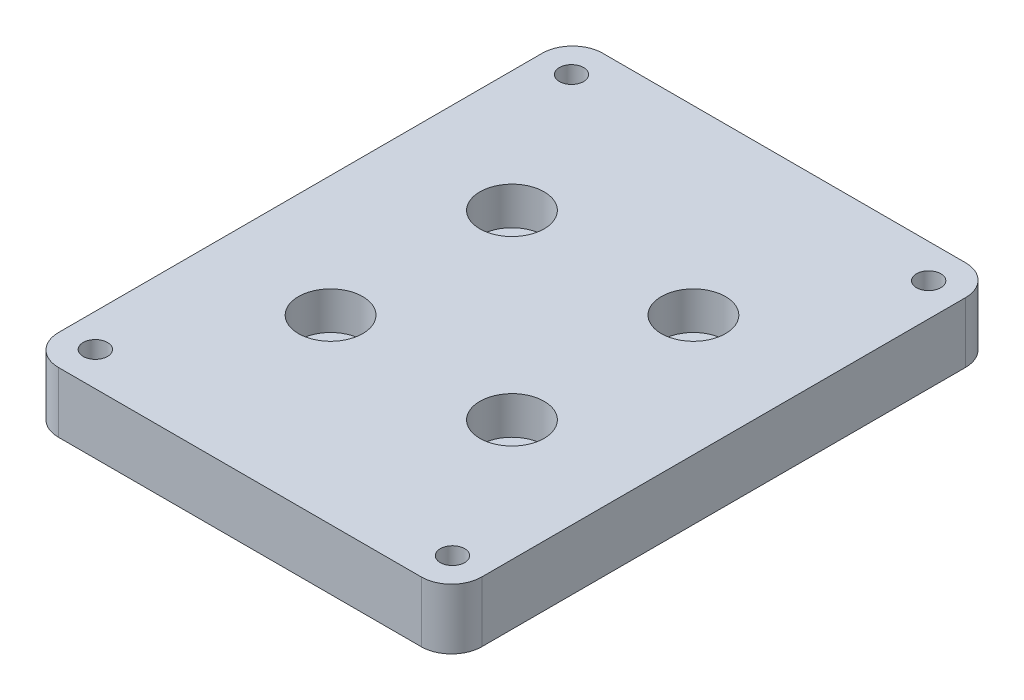
ISO-10303-21;
HEADER;
FILE_DESCRIPTION(('STEP AP214'),'2;1');
FILE_NAME('part.step','',(''),(''),'','','');
FILE_SCHEMA(('AUTOMOTIVE_DESIGN { 1 0 10303 214 1 1 1 1 }'));
ENDSEC;
DATA;
#1=APPLICATION_CONTEXT('core data for automotive mechanical design processes');
#2=APPLICATION_PROTOCOL_DEFINITION('international standard','automotive_design',2000,#1);
#3=PRODUCT_CONTEXT('',#1,'mechanical');
#4=PRODUCT('Part','Part','',(#3));
#5=PRODUCT_RELATED_PRODUCT_CATEGORY('part','',(#4));
#6=PRODUCT_DEFINITION_FORMATION('','',#4);
#7=PRODUCT_DEFINITION_CONTEXT('part definition',#1,'design');
#8=PRODUCT_DEFINITION('design','',#6,#7);
#9=PRODUCT_DEFINITION_SHAPE('','',#8);
#10=(LENGTH_UNIT() NAMED_UNIT(*) SI_UNIT(.MILLI.,.METRE.));
#11=(NAMED_UNIT(*) PLANE_ANGLE_UNIT() SI_UNIT($,.RADIAN.));
#12=(NAMED_UNIT(*) SI_UNIT($,.STERADIAN.) SOLID_ANGLE_UNIT());
#13=UNCERTAINTY_MEASURE_WITH_UNIT(LENGTH_MEASURE(1.E-05),#10,'distance_accuracy_value','');
#14=(GEOMETRIC_REPRESENTATION_CONTEXT(3) GLOBAL_UNCERTAINTY_ASSIGNED_CONTEXT((#13)) GLOBAL_UNIT_ASSIGNED_CONTEXT((#10,
#11,#12)) REPRESENTATION_CONTEXT('',''));
#15=CARTESIAN_POINT('',(0.,0.,0.));
#16=DIRECTION('',(0.,0.,1.));
#17=DIRECTION('',(1.,0.,0.));
#18=AXIS2_PLACEMENT_3D('',#15,#16,#17);
#19=CARTESIAN_POINT('',(-44.45,12.7,57.15));
#20=DIRECTION('',(1.,0.,0.));
#21=DIRECTION('',(0.,0.,-1.));
#22=AXIS2_PLACEMENT_3D('',#19,#20,#21);
#23=PLANE('',#22);
#24=DIRECTION('',(0.,0.,1.));
#25=VECTOR('',#24,1.);
#26=CARTESIAN_POINT('',(-44.45,12.7,57.15));
#27=LINE('',#26,#25);
#28=CARTESIAN_POINT('',(-44.45,12.7,-50.8));
#29=VERTEX_POINT('',#28);
#30=CARTESIAN_POINT('',(-44.45,12.7,50.8));
#31=VERTEX_POINT('',#30);
#32=EDGE_CURVE('E121',#29,#31,#27,.T.);
#33=ORIENTED_EDGE('',*,*,#32,.F.);
#34=DIRECTION('',(0.,-1.,0.));
#35=VECTOR('',#34,1.);
#36=CARTESIAN_POINT('',(-44.45,12.7,-50.8));
#37=LINE('',#36,#35);
#38=CARTESIAN_POINT('',(-44.45,0.,-50.8));
#39=VERTEX_POINT('',#38);
#40=EDGE_CURVE('E106',#29,#39,#37,.T.);
#41=ORIENTED_EDGE('',*,*,#40,.T.);
#42=DIRECTION('',(0.,0.,1.));
#43=VECTOR('',#42,1.);
#44=CARTESIAN_POINT('',(-44.45,0.,57.15));
#45=LINE('',#44,#43);
#46=CARTESIAN_POINT('',(-44.45,0.,50.8));
#47=VERTEX_POINT('',#46);
#48=EDGE_CURVE('E118',#39,#47,#45,.T.);
#49=ORIENTED_EDGE('',*,*,#48,.T.);
#50=DIRECTION('',(0.,-1.,0.));
#51=VECTOR('',#50,1.);
#52=CARTESIAN_POINT('',(-44.45,12.7,50.8));
#53=LINE('',#52,#51);
#54=EDGE_CURVE('E123',#47,#31,#53,.F.);
#55=ORIENTED_EDGE('',*,*,#54,.T.);
#56=EDGE_LOOP('',(#33,#41,#49,#55));
#57=FACE_BOUND('',#56,.T.);
#58=ADVANCED_FACE('F36',(#57),#23,.F.);
#59=CARTESIAN_POINT('',(44.45,12.7,57.15));
#60=DIRECTION('',(0.,0.,-1.));
#61=DIRECTION('',(-1.,0.,0.));
#62=AXIS2_PLACEMENT_3D('',#59,#60,#61);
#63=PLANE('',#62);
#64=DIRECTION('',(1.,0.,0.));
#65=VECTOR('',#64,1.);
#66=CARTESIAN_POINT('',(44.45,0.,57.15));
#67=LINE('',#66,#65);
#68=CARTESIAN_POINT('',(-38.1,0.,57.15));
#69=VERTEX_POINT('',#68);
#70=CARTESIAN_POINT('',(38.1,0.,57.15));
#71=VERTEX_POINT('',#70);
#72=EDGE_CURVE('E127',#69,#71,#67,.T.);
#73=ORIENTED_EDGE('',*,*,#72,.T.);
#74=DIRECTION('',(0.,-1.,0.));
#75=VECTOR('',#74,1.);
#76=CARTESIAN_POINT('',(38.1,12.7,57.15));
#77=LINE('',#76,#75);
#78=CARTESIAN_POINT('',(38.1,12.7,57.15));
#79=VERTEX_POINT('',#78);
#80=EDGE_CURVE('E11',#71,#79,#77,.F.);
#81=ORIENTED_EDGE('',*,*,#80,.T.);
#82=DIRECTION('',(1.,0.,0.));
#83=VECTOR('',#82,1.);
#84=CARTESIAN_POINT('',(44.45,12.7,57.15));
#85=LINE('',#84,#83);
#86=CARTESIAN_POINT('',(-38.1,12.7,57.15));
#87=VERTEX_POINT('',#86);
#88=EDGE_CURVE('E167',#87,#79,#85,.T.);
#89=ORIENTED_EDGE('',*,*,#88,.F.);
#90=DIRECTION('',(0.,-1.,0.));
#91=VECTOR('',#90,1.);
#92=CARTESIAN_POINT('',(-38.1,12.7,57.15));
#93=LINE('',#92,#91);
#94=EDGE_CURVE('E44',#87,#69,#93,.T.);
#95=ORIENTED_EDGE('',*,*,#94,.T.);
#96=EDGE_LOOP('',(#73,#81,#89,#95));
#97=FACE_BOUND('',#96,.T.);
#98=ADVANCED_FACE('F165',(#97),#63,.F.);
#99=CARTESIAN_POINT('',(44.45,12.7,57.15));
#100=DIRECTION('',(-1.,0.,0.));
#101=DIRECTION('',(0.,0.,1.));
#102=AXIS2_PLACEMENT_3D('',#99,#100,#101);
#103=PLANE('',#102);
#104=DIRECTION('',(0.,0.,-1.));
#105=VECTOR('',#104,1.);
#106=CARTESIAN_POINT('',(44.45,0.,57.15));
#107=LINE('',#106,#105);
#108=CARTESIAN_POINT('',(44.45,0.,50.8));
#109=VERTEX_POINT('',#108);
#110=CARTESIAN_POINT('',(44.45,0.,-50.8));
#111=VERTEX_POINT('',#110);
#112=EDGE_CURVE('E131',#109,#111,#107,.T.);
#113=ORIENTED_EDGE('',*,*,#112,.T.);
#114=DIRECTION('',(0.,-1.,0.));
#115=VECTOR('',#114,1.);
#116=CARTESIAN_POINT('',(44.45,12.7,-50.8));
#117=LINE('',#116,#115);
#118=CARTESIAN_POINT('',(44.45,12.7,-50.8));
#119=VERTEX_POINT('',#118);
#120=EDGE_CURVE('E51',#111,#119,#117,.F.);
#121=ORIENTED_EDGE('',*,*,#120,.T.);
#122=DIRECTION('',(0.,0.,-1.));
#123=VECTOR('',#122,1.);
#124=CARTESIAN_POINT('',(44.45,12.7,57.15));
#125=LINE('',#124,#123);
#126=CARTESIAN_POINT('',(44.45,12.7,50.8));
#127=VERTEX_POINT('',#126);
#128=EDGE_CURVE('E175',#127,#119,#125,.T.);
#129=ORIENTED_EDGE('',*,*,#128,.F.);
#130=DIRECTION('',(0.,-1.,0.));
#131=VECTOR('',#130,1.);
#132=CARTESIAN_POINT('',(44.45,12.7,50.8));
#133=LINE('',#132,#131);
#134=EDGE_CURVE('E158',#127,#109,#133,.T.);
#135=ORIENTED_EDGE('',*,*,#134,.T.);
#136=EDGE_LOOP('',(#113,#121,#129,#135));
#137=FACE_BOUND('',#136,.T.);
#138=ADVANCED_FACE('F174',(#137),#103,.F.);
#139=CARTESIAN_POINT('',(44.45,12.7,-57.15));
#140=DIRECTION('',(0.,0.,1.));
#141=DIRECTION('',(1.,0.,0.));
#142=AXIS2_PLACEMENT_3D('',#139,#140,#141);
#143=PLANE('',#142);
#144=DIRECTION('',(-1.,0.,0.));
#145=VECTOR('',#144,1.);
#146=CARTESIAN_POINT('',(44.45,0.,-57.15));
#147=LINE('',#146,#145);
#148=CARTESIAN_POINT('',(38.1,0.,-57.15));
#149=VERTEX_POINT('',#148);
#150=CARTESIAN_POINT('',(-38.1,0.,-57.15));
#151=VERTEX_POINT('',#150);
#152=EDGE_CURVE('E141',#149,#151,#147,.T.);
#153=ORIENTED_EDGE('',*,*,#152,.T.);
#154=DIRECTION('',(0.,-1.,0.));
#155=VECTOR('',#154,1.);
#156=CARTESIAN_POINT('',(-38.1,12.7,-57.15));
#157=LINE('',#156,#155);
#158=CARTESIAN_POINT('',(-38.1,12.7,-57.15));
#159=VERTEX_POINT('',#158);
#160=EDGE_CURVE('E107',#151,#159,#157,.F.);
#161=ORIENTED_EDGE('',*,*,#160,.T.);
#162=DIRECTION('',(-1.,0.,0.));
#163=VECTOR('',#162,1.);
#164=CARTESIAN_POINT('',(44.45,12.7,-57.15));
#165=LINE('',#164,#163);
#166=CARTESIAN_POINT('',(38.1,12.7,-57.15));
#167=VERTEX_POINT('',#166);
#168=EDGE_CURVE('E137',#167,#159,#165,.T.);
#169=ORIENTED_EDGE('',*,*,#168,.F.);
#170=DIRECTION('',(0.,-1.,0.));
#171=VECTOR('',#170,1.);
#172=CARTESIAN_POINT('',(38.1,12.7,-57.15));
#173=LINE('',#172,#171);
#174=EDGE_CURVE('E112',#167,#149,#173,.T.);
#175=ORIENTED_EDGE('',*,*,#174,.T.);
#176=EDGE_LOOP('',(#153,#161,#169,#175));
#177=FACE_BOUND('',#176,.T.);
#178=ADVANCED_FACE('F255',(#177),#143,.F.);
#179=CARTESIAN_POINT('',(0.,12.7,0.));
#180=DIRECTION('',(0.,1.,0.));
#181=DIRECTION('',(0.,0.,1.));
#182=AXIS2_PLACEMENT_3D('',#179,#180,#181);
#183=PLANE('',#182);
#184=CARTESIAN_POINT('',(-37.5,12.7,-50.));
#185=DIRECTION('',(0.,1.,0.));
#186=DIRECTION('',(0.,0.,1.));
#187=AXIS2_PLACEMENT_3D('',#184,#185,#186);
#188=CIRCLE('',#187,2.5527);
#189=CARTESIAN_POINT('',(-37.5,12.7,-47.4473));
#190=VERTEX_POINT('',#189);
#191=EDGE_CURVE('E246',#190,#190,#188,.T.);
#192=ORIENTED_EDGE('',*,*,#191,.F.);
#193=EDGE_LOOP('',(#192));
#194=FACE_BOUND('',#193,.T.);
#195=CARTESIAN_POINT('',(37.5,12.7,-50.));
#196=DIRECTION('',(0.,1.,0.));
#197=DIRECTION('',(0.,0.,1.));
#198=AXIS2_PLACEMENT_3D('',#195,#196,#197);
#199=CIRCLE('',#198,2.5527);
#200=CARTESIAN_POINT('',(37.5,12.7,-47.4473));
#201=VERTEX_POINT('',#200);
#202=EDGE_CURVE('E240',#201,#201,#199,.T.);
#203=ORIENTED_EDGE('',*,*,#202,.F.);
#204=EDGE_LOOP('',(#203));
#205=FACE_BOUND('',#204,.T.);
#206=CARTESIAN_POINT('',(37.5,12.7,50.));
#207=DIRECTION('',(0.,1.,0.));
#208=DIRECTION('',(0.,0.,1.));
#209=AXIS2_PLACEMENT_3D('',#206,#207,#208);
#210=CIRCLE('',#209,2.5527);
#211=CARTESIAN_POINT('',(37.5,12.7,52.5527));
#212=VERTEX_POINT('',#211);
#213=EDGE_CURVE('E234',#212,#212,#210,.T.);
#214=ORIENTED_EDGE('',*,*,#213,.F.);
#215=EDGE_LOOP('',(#214));
#216=FACE_BOUND('',#215,.T.);
#217=CARTESIAN_POINT('',(-37.5,12.7,50.));
#218=DIRECTION('',(0.,1.,0.));
#219=DIRECTION('',(0.,0.,1.));
#220=AXIS2_PLACEMENT_3D('',#217,#218,#219);
#221=CIRCLE('',#220,2.5527);
#222=CARTESIAN_POINT('',(-37.5,12.7,52.5527));
#223=VERTEX_POINT('',#222);
#224=EDGE_CURVE('E228',#223,#223,#221,.T.);
#225=ORIENTED_EDGE('',*,*,#224,.F.);
#226=EDGE_LOOP('',(#225));
#227=FACE_BOUND('',#226,.T.);
#228=CARTESIAN_POINT('',(-19.05,12.7,-19.05));
#229=DIRECTION('',(0.,1.,0.));
#230=DIRECTION('',(0.,0.,1.));
#231=AXIS2_PLACEMENT_3D('',#228,#229,#230);
#232=CIRCLE('',#231,6.74751);
#233=CARTESIAN_POINT('',(-19.05,12.7,-12.30249));
#234=VERTEX_POINT('',#233);
#235=EDGE_CURVE('E222',#234,#234,#232,.T.);
#236=ORIENTED_EDGE('',*,*,#235,.F.);
#237=EDGE_LOOP('',(#236));
#238=FACE_BOUND('',#237,.T.);
#239=CARTESIAN_POINT('',(-19.05,12.7,19.05));
#240=DIRECTION('',(0.,1.,0.));
#241=DIRECTION('',(0.,0.,1.));
#242=AXIS2_PLACEMENT_3D('',#239,#240,#241);
#243=CIRCLE('',#242,6.74751);
#244=CARTESIAN_POINT('',(-19.05,12.7,25.79751));
#245=VERTEX_POINT('',#244);
#246=EDGE_CURVE('E210',#245,#245,#243,.T.);
#247=ORIENTED_EDGE('',*,*,#246,.F.);
#248=EDGE_LOOP('',(#247));
#249=FACE_BOUND('',#248,.T.);
#250=CARTESIAN_POINT('',(19.05,12.7,19.05));
#251=DIRECTION('',(0.,1.,0.));
#252=DIRECTION('',(0.,0.,1.));
#253=AXIS2_PLACEMENT_3D('',#250,#251,#252);
#254=CIRCLE('',#253,6.74751);
#255=CARTESIAN_POINT('',(19.05,12.7,25.79751));
#256=VERTEX_POINT('',#255);
#257=EDGE_CURVE('E198',#256,#256,#254,.T.);
#258=ORIENTED_EDGE('',*,*,#257,.F.);
#259=EDGE_LOOP('',(#258));
#260=FACE_BOUND('',#259,.T.);
#261=CARTESIAN_POINT('',(19.05,12.7,-19.05));
#262=DIRECTION('',(0.,1.,0.));
#263=DIRECTION('',(0.,0.,1.));
#264=AXIS2_PLACEMENT_3D('',#261,#262,#263);
#265=CIRCLE('',#264,6.74751);
#266=CARTESIAN_POINT('',(19.05,12.7,-12.30249));
#267=VERTEX_POINT('',#266);
#268=EDGE_CURVE('E186',#267,#267,#265,.T.);
#269=ORIENTED_EDGE('',*,*,#268,.F.);
#270=EDGE_LOOP('',(#269));
#271=FACE_BOUND('',#270,.T.);
#272=ORIENTED_EDGE('',*,*,#168,.T.);
#273=CARTESIAN_POINT('',(-38.1,12.7,-50.8));
#274=DIRECTION('',(0.,1.,0.));
#275=DIRECTION('',(0.,0.,1.));
#276=AXIS2_PLACEMENT_3D('',#273,#274,#275);
#277=CIRCLE('',#276,6.35);
#278=EDGE_CURVE('E156',#159,#29,#277,.T.);
#279=ORIENTED_EDGE('',*,*,#278,.T.);
#280=ORIENTED_EDGE('',*,*,#32,.T.);
#281=CARTESIAN_POINT('',(-38.1,12.7,50.8));
#282=DIRECTION('',(0.,1.,0.));
#283=DIRECTION('',(0.,0.,1.));
#284=AXIS2_PLACEMENT_3D('',#281,#282,#283);
#285=CIRCLE('',#284,6.35);
#286=EDGE_CURVE('E151',#31,#87,#285,.T.);
#287=ORIENTED_EDGE('',*,*,#286,.T.);
#288=ORIENTED_EDGE('',*,*,#88,.T.);
#289=CARTESIAN_POINT('',(38.1,12.7,50.8));
#290=DIRECTION('',(0.,1.,0.));
#291=DIRECTION('',(0.,0.,1.));
#292=AXIS2_PLACEMENT_3D('',#289,#290,#291);
#293=CIRCLE('',#292,6.35);
#294=EDGE_CURVE('E58',#79,#127,#293,.T.);
#295=ORIENTED_EDGE('',*,*,#294,.T.);
#296=ORIENTED_EDGE('',*,*,#128,.T.);
#297=CARTESIAN_POINT('',(38.1,12.7,-50.8));
#298=DIRECTION('',(0.,1.,0.));
#299=DIRECTION('',(0.,0.,1.));
#300=AXIS2_PLACEMENT_3D('',#297,#298,#299);
#301=CIRCLE('',#300,6.35);
#302=EDGE_CURVE('E154',#119,#167,#301,.T.);
#303=ORIENTED_EDGE('',*,*,#302,.T.);
#304=EDGE_LOOP('',(#272,#279,#280,#287,#288,#295,#296,#303));
#305=FACE_BOUND('',#304,.T.);
#306=ADVANCED_FACE('F252',(#194,#205,#216,#227,#238,#249,#260,#271,#305),#183,.T.);
#307=CARTESIAN_POINT('',(0.,0.,0.));
#308=DIRECTION('',(0.,1.,0.));
#309=DIRECTION('',(0.,0.,1.));
#310=AXIS2_PLACEMENT_3D('',#307,#308,#309);
#311=PLANE('',#310);
#312=CARTESIAN_POINT('',(-37.5,0.,-50.));
#313=DIRECTION('',(0.,1.,0.));
#314=DIRECTION('',(0.,0.,1.));
#315=AXIS2_PLACEMENT_3D('',#312,#313,#314);
#316=CIRCLE('',#315,2.5527);
#317=CARTESIAN_POINT('',(-37.5,0.,-47.4473));
#318=VERTEX_POINT('',#317);
#319=EDGE_CURVE('E243',#318,#318,#316,.T.);
#320=ORIENTED_EDGE('',*,*,#319,.T.);
#321=EDGE_LOOP('',(#320));
#322=FACE_BOUND('',#321,.T.);
#323=CARTESIAN_POINT('',(37.5,0.,-50.));
#324=DIRECTION('',(0.,1.,0.));
#325=DIRECTION('',(0.,0.,1.));
#326=AXIS2_PLACEMENT_3D('',#323,#324,#325);
#327=CIRCLE('',#326,2.5527);
#328=CARTESIAN_POINT('',(37.5,0.,-47.4473));
#329=VERTEX_POINT('',#328);
#330=EDGE_CURVE('E237',#329,#329,#327,.T.);
#331=ORIENTED_EDGE('',*,*,#330,.T.);
#332=EDGE_LOOP('',(#331));
#333=FACE_BOUND('',#332,.T.);
#334=CARTESIAN_POINT('',(37.5,0.,50.));
#335=DIRECTION('',(0.,1.,0.));
#336=DIRECTION('',(0.,0.,1.));
#337=AXIS2_PLACEMENT_3D('',#334,#335,#336);
#338=CIRCLE('',#337,2.5527);
#339=CARTESIAN_POINT('',(37.5,0.,52.5527));
#340=VERTEX_POINT('',#339);
#341=EDGE_CURVE('E231',#340,#340,#338,.T.);
#342=ORIENTED_EDGE('',*,*,#341,.T.);
#343=EDGE_LOOP('',(#342));
#344=FACE_BOUND('',#343,.T.);
#345=CARTESIAN_POINT('',(-37.5,0.,50.));
#346=DIRECTION('',(0.,1.,0.));
#347=DIRECTION('',(0.,0.,1.));
#348=AXIS2_PLACEMENT_3D('',#345,#346,#347);
#349=CIRCLE('',#348,2.5527);
#350=CARTESIAN_POINT('',(-37.5,0.,52.5527));
#351=VERTEX_POINT('',#350);
#352=EDGE_CURVE('E225',#351,#351,#349,.T.);
#353=ORIENTED_EDGE('',*,*,#352,.T.);
#354=EDGE_LOOP('',(#353));
#355=FACE_BOUND('',#354,.T.);
#356=CARTESIAN_POINT('',(-19.05,0.,-19.05));
#357=DIRECTION('',(0.,1.,0.));
#358=DIRECTION('',(0.,0.,1.));
#359=AXIS2_PLACEMENT_3D('',#356,#357,#358);
#360=CIRCLE('',#359,4.2164);
#361=CARTESIAN_POINT('',(-19.05,0.,-14.8336));
#362=VERTEX_POINT('',#361);
#363=EDGE_CURVE('E213',#362,#362,#360,.T.);
#364=ORIENTED_EDGE('',*,*,#363,.T.);
#365=EDGE_LOOP('',(#364));
#366=FACE_BOUND('',#365,.T.);
#367=CARTESIAN_POINT('',(-19.05,0.,19.05));
#368=DIRECTION('',(0.,1.,0.));
#369=DIRECTION('',(0.,0.,1.));
#370=AXIS2_PLACEMENT_3D('',#367,#368,#369);
#371=CIRCLE('',#370,4.2164);
#372=CARTESIAN_POINT('',(-19.05,0.,23.2664));
#373=VERTEX_POINT('',#372);
#374=EDGE_CURVE('E201',#373,#373,#371,.T.);
#375=ORIENTED_EDGE('',*,*,#374,.T.);
#376=EDGE_LOOP('',(#375));
#377=FACE_BOUND('',#376,.T.);
#378=CARTESIAN_POINT('',(19.05,0.,19.05));
#379=DIRECTION('',(0.,1.,0.));
#380=DIRECTION('',(0.,0.,1.));
#381=AXIS2_PLACEMENT_3D('',#378,#379,#380);
#382=CIRCLE('',#381,4.2164);
#383=CARTESIAN_POINT('',(19.05,0.,23.2664));
#384=VERTEX_POINT('',#383);
#385=EDGE_CURVE('E189',#384,#384,#382,.T.);
#386=ORIENTED_EDGE('',*,*,#385,.T.);
#387=EDGE_LOOP('',(#386));
#388=FACE_BOUND('',#387,.T.);
#389=CARTESIAN_POINT('',(19.05,0.,-19.05));
#390=DIRECTION('',(0.,1.,0.));
#391=DIRECTION('',(0.,0.,1.));
#392=AXIS2_PLACEMENT_3D('',#389,#390,#391);
#393=CIRCLE('',#392,4.2164);
#394=CARTESIAN_POINT('',(19.05,0.,-14.8336));
#395=VERTEX_POINT('',#394);
#396=EDGE_CURVE('E128',#395,#395,#393,.T.);
#397=ORIENTED_EDGE('',*,*,#396,.T.);
#398=EDGE_LOOP('',(#397));
#399=FACE_BOUND('',#398,.T.);
#400=ORIENTED_EDGE('',*,*,#48,.F.);
#401=CARTESIAN_POINT('',(-38.1,0.,-50.8));
#402=DIRECTION('',(0.,1.,0.));
#403=DIRECTION('',(0.,0.,1.));
#404=AXIS2_PLACEMENT_3D('',#401,#402,#403);
#405=CIRCLE('',#404,6.35);
#406=EDGE_CURVE('E102',#39,#151,#405,.F.);
#407=ORIENTED_EDGE('',*,*,#406,.T.);
#408=ORIENTED_EDGE('',*,*,#152,.F.);
#409=CARTESIAN_POINT('',(38.1,0.,-50.8));
#410=DIRECTION('',(0.,1.,0.));
#411=DIRECTION('',(0.,0.,1.));
#412=AXIS2_PLACEMENT_3D('',#409,#410,#411);
#413=CIRCLE('',#412,6.35);
#414=EDGE_CURVE('E113',#149,#111,#413,.F.);
#415=ORIENTED_EDGE('',*,*,#414,.T.);
#416=ORIENTED_EDGE('',*,*,#112,.F.);
#417=CARTESIAN_POINT('',(38.1,0.,50.8));
#418=DIRECTION('',(0.,1.,0.));
#419=DIRECTION('',(0.,0.,1.));
#420=AXIS2_PLACEMENT_3D('',#417,#418,#419);
#421=CIRCLE('',#420,6.35);
#422=EDGE_CURVE('E145',#109,#71,#421,.F.);
#423=ORIENTED_EDGE('',*,*,#422,.T.);
#424=ORIENTED_EDGE('',*,*,#72,.F.);
#425=CARTESIAN_POINT('',(-38.1,0.,50.8));
#426=DIRECTION('',(0.,1.,0.));
#427=DIRECTION('',(0.,0.,1.));
#428=AXIS2_PLACEMENT_3D('',#425,#426,#427);
#429=CIRCLE('',#428,6.35);
#430=EDGE_CURVE('E122',#69,#47,#429,.F.);
#431=ORIENTED_EDGE('',*,*,#430,.T.);
#432=EDGE_LOOP('',(#400,#407,#408,#415,#416,#423,#424,#431));
#433=FACE_BOUND('',#432,.T.);
#434=ADVANCED_FACE('F125',(#322,#333,#344,#355,#366,#377,#388,#399,#433),#311,.F.);
#435=CARTESIAN_POINT('',(-38.1,12.7,-50.8));
#436=DIRECTION('',(0.,-1.,0.));
#437=DIRECTION('',(0.,0.,-1.));
#438=AXIS2_PLACEMENT_3D('',#435,#436,#437);
#439=CYLINDRICAL_SURFACE('',#438,6.35);
#440=ORIENTED_EDGE('',*,*,#278,.F.);
#441=ORIENTED_EDGE('',*,*,#160,.F.);
#442=ORIENTED_EDGE('',*,*,#406,.F.);
#443=ORIENTED_EDGE('',*,*,#40,.F.);
#444=EDGE_LOOP('',(#440,#441,#442,#443));
#445=FACE_BOUND('',#444,.T.);
#446=ADVANCED_FACE('F105',(#445),#439,.T.);
#447=CARTESIAN_POINT('',(38.1,12.7,-50.8));
#448=DIRECTION('',(0.,-1.,0.));
#449=DIRECTION('',(0.,0.,-1.));
#450=AXIS2_PLACEMENT_3D('',#447,#448,#449);
#451=CYLINDRICAL_SURFACE('',#450,6.35);
#452=ORIENTED_EDGE('',*,*,#302,.F.);
#453=ORIENTED_EDGE('',*,*,#120,.F.);
#454=ORIENTED_EDGE('',*,*,#414,.F.);
#455=ORIENTED_EDGE('',*,*,#174,.F.);
#456=EDGE_LOOP('',(#452,#453,#454,#455));
#457=FACE_BOUND('',#456,.T.);
#458=ADVANCED_FACE('F274',(#457),#451,.T.);
#459=CARTESIAN_POINT('',(38.1,12.7,50.8));
#460=DIRECTION('',(0.,-1.,0.));
#461=DIRECTION('',(0.,0.,-1.));
#462=AXIS2_PLACEMENT_3D('',#459,#460,#461);
#463=CYLINDRICAL_SURFACE('',#462,6.35);
#464=ORIENTED_EDGE('',*,*,#294,.F.);
#465=ORIENTED_EDGE('',*,*,#80,.F.);
#466=ORIENTED_EDGE('',*,*,#422,.F.);
#467=ORIENTED_EDGE('',*,*,#134,.F.);
#468=EDGE_LOOP('',(#464,#465,#466,#467));
#469=FACE_BOUND('',#468,.T.);
#470=ADVANCED_FACE('F173',(#469),#463,.T.);
#471=CARTESIAN_POINT('',(-38.1,12.7,50.8));
#472=DIRECTION('',(0.,-1.,0.));
#473=DIRECTION('',(0.,0.,-1.));
#474=AXIS2_PLACEMENT_3D('',#471,#472,#473);
#475=CYLINDRICAL_SURFACE('',#474,6.35);
#476=ORIENTED_EDGE('',*,*,#286,.F.);
#477=ORIENTED_EDGE('',*,*,#54,.F.);
#478=ORIENTED_EDGE('',*,*,#430,.F.);
#479=ORIENTED_EDGE('',*,*,#94,.F.);
#480=EDGE_LOOP('',(#476,#477,#478,#479));
#481=FACE_BOUND('',#480,.T.);
#482=ADVANCED_FACE('F38',(#481),#475,.T.);
#483=CARTESIAN_POINT('',(19.05,12.7,-19.05));
#484=DIRECTION('',(0.,1.,0.));
#485=DIRECTION('',(0.,0.,1.));
#486=AXIS2_PLACEMENT_3D('',#483,#484,#485);
#487=CYLINDRICAL_SURFACE('',#486,4.2164);
#488=ORIENTED_EDGE('',*,*,#396,.F.);
#489=EDGE_LOOP('',(#488));
#490=FACE_BOUND('',#489,.T.);
#491=CARTESIAN_POINT('',(19.05,4.7625,-19.05));
#492=DIRECTION('',(0.,1.,0.));
#493=DIRECTION('',(0.,0.,1.));
#494=AXIS2_PLACEMENT_3D('',#491,#492,#493);
#495=CIRCLE('',#494,4.2164);
#496=CARTESIAN_POINT('',(19.05,4.7625,-14.8336));
#497=VERTEX_POINT('',#496);
#498=EDGE_CURVE('E134',#497,#497,#495,.T.);
#499=ORIENTED_EDGE('',*,*,#498,.T.);
#500=EDGE_LOOP('',(#499));
#501=FACE_BOUND('',#500,.T.);
#502=ADVANCED_FACE('F296',(#490,#501),#487,.F.);
#503=CARTESIAN_POINT('',(23.2664,4.7625,-19.05));
#504=DIRECTION('',(0.,-1.,0.));
#505=DIRECTION('',(0.,0.,-1.));
#506=AXIS2_PLACEMENT_3D('',#503,#504,#505);
#507=PLANE('',#506);
#508=ORIENTED_EDGE('',*,*,#498,.F.);
#509=EDGE_LOOP('',(#508));
#510=FACE_BOUND('',#509,.T.);
#511=CARTESIAN_POINT('',(19.05,4.7625,-19.05));
#512=DIRECTION('',(0.,1.,0.));
#513=DIRECTION('',(0.,0.,1.));
#514=AXIS2_PLACEMENT_3D('',#511,#512,#513);
#515=CIRCLE('',#514,6.74751);
#516=CARTESIAN_POINT('',(19.05,4.7625,-12.30249));
#517=VERTEX_POINT('',#516);
#518=EDGE_CURVE('E183',#517,#517,#515,.T.);
#519=ORIENTED_EDGE('',*,*,#518,.T.);
#520=EDGE_LOOP('',(#519));
#521=FACE_BOUND('',#520,.T.);
#522=ADVANCED_FACE('F299',(#510,#521),#507,.F.);
#523=CARTESIAN_POINT('',(19.05,12.7,-19.05));
#524=DIRECTION('',(0.,1.,0.));
#525=DIRECTION('',(0.,0.,1.));
#526=AXIS2_PLACEMENT_3D('',#523,#524,#525);
#527=CYLINDRICAL_SURFACE('',#526,6.74751);
#528=ORIENTED_EDGE('',*,*,#518,.F.);
#529=EDGE_LOOP('',(#528));
#530=FACE_BOUND('',#529,.T.);
#531=ORIENTED_EDGE('',*,*,#268,.T.);
#532=EDGE_LOOP('',(#531));
#533=FACE_BOUND('',#532,.T.);
#534=ADVANCED_FACE('F303',(#530,#533),#527,.F.);
#535=CARTESIAN_POINT('',(19.05,12.7,19.05));
#536=DIRECTION('',(0.,1.,0.));
#537=DIRECTION('',(0.,0.,1.));
#538=AXIS2_PLACEMENT_3D('',#535,#536,#537);
#539=CYLINDRICAL_SURFACE('',#538,4.2164);
#540=ORIENTED_EDGE('',*,*,#385,.F.);
#541=EDGE_LOOP('',(#540));
#542=FACE_BOUND('',#541,.T.);
#543=CARTESIAN_POINT('',(19.05,4.7625,19.05));
#544=DIRECTION('',(0.,1.,0.));
#545=DIRECTION('',(0.,0.,1.));
#546=AXIS2_PLACEMENT_3D('',#543,#544,#545);
#547=CIRCLE('',#546,4.2164);
#548=CARTESIAN_POINT('',(19.05,4.7625,23.2664));
#549=VERTEX_POINT('',#548);
#550=EDGE_CURVE('E192',#549,#549,#547,.T.);
#551=ORIENTED_EDGE('',*,*,#550,.T.);
#552=EDGE_LOOP('',(#551));
#553=FACE_BOUND('',#552,.T.);
#554=ADVANCED_FACE('F307',(#542,#553),#539,.F.);
#555=CARTESIAN_POINT('',(23.2664,4.7625,19.05));
#556=DIRECTION('',(0.,-1.,0.));
#557=DIRECTION('',(0.,0.,-1.));
#558=AXIS2_PLACEMENT_3D('',#555,#556,#557);
#559=PLANE('',#558);
#560=ORIENTED_EDGE('',*,*,#550,.F.);
#561=EDGE_LOOP('',(#560));
#562=FACE_BOUND('',#561,.T.);
#563=CARTESIAN_POINT('',(19.05,4.7625,19.05));
#564=DIRECTION('',(0.,1.,0.));
#565=DIRECTION('',(0.,0.,1.));
#566=AXIS2_PLACEMENT_3D('',#563,#564,#565);
#567=CIRCLE('',#566,6.74751);
#568=CARTESIAN_POINT('',(19.05,4.7625,25.79751));
#569=VERTEX_POINT('',#568);
#570=EDGE_CURVE('E195',#569,#569,#567,.T.);
#571=ORIENTED_EDGE('',*,*,#570,.T.);
#572=EDGE_LOOP('',(#571));
#573=FACE_BOUND('',#572,.T.);
#574=ADVANCED_FACE('F311',(#562,#573),#559,.F.);
#575=CARTESIAN_POINT('',(19.05,12.7,19.05));
#576=DIRECTION('',(0.,1.,0.));
#577=DIRECTION('',(0.,0.,1.));
#578=AXIS2_PLACEMENT_3D('',#575,#576,#577);
#579=CYLINDRICAL_SURFACE('',#578,6.74751);
#580=ORIENTED_EDGE('',*,*,#570,.F.);
#581=EDGE_LOOP('',(#580));
#582=FACE_BOUND('',#581,.T.);
#583=ORIENTED_EDGE('',*,*,#257,.T.);
#584=EDGE_LOOP('',(#583));
#585=FACE_BOUND('',#584,.T.);
#586=ADVANCED_FACE('F315',(#582,#585),#579,.F.);
#587=CARTESIAN_POINT('',(-19.05,12.7,19.05));
#588=DIRECTION('',(0.,1.,0.));
#589=DIRECTION('',(0.,0.,1.));
#590=AXIS2_PLACEMENT_3D('',#587,#588,#589);
#591=CYLINDRICAL_SURFACE('',#590,4.2164);
#592=ORIENTED_EDGE('',*,*,#374,.F.);
#593=EDGE_LOOP('',(#592));
#594=FACE_BOUND('',#593,.T.);
#595=CARTESIAN_POINT('',(-19.05,4.7625,19.05));
#596=DIRECTION('',(0.,1.,0.));
#597=DIRECTION('',(0.,0.,1.));
#598=AXIS2_PLACEMENT_3D('',#595,#596,#597);
#599=CIRCLE('',#598,4.2164);
#600=CARTESIAN_POINT('',(-19.05,4.7625,23.2664));
#601=VERTEX_POINT('',#600);
#602=EDGE_CURVE('E204',#601,#601,#599,.T.);
#603=ORIENTED_EDGE('',*,*,#602,.T.);
#604=EDGE_LOOP('',(#603));
#605=FACE_BOUND('',#604,.T.);
#606=ADVANCED_FACE('F319',(#594,#605),#591,.F.);
#607=CARTESIAN_POINT('',(-14.8336,4.7625,19.05));
#608=DIRECTION('',(0.,-1.,0.));
#609=DIRECTION('',(0.,0.,-1.));
#610=AXIS2_PLACEMENT_3D('',#607,#608,#609);
#611=PLANE('',#610);
#612=ORIENTED_EDGE('',*,*,#602,.F.);
#613=EDGE_LOOP('',(#612));
#614=FACE_BOUND('',#613,.T.);
#615=CARTESIAN_POINT('',(-19.05,4.7625,19.05));
#616=DIRECTION('',(0.,1.,0.));
#617=DIRECTION('',(0.,0.,1.));
#618=AXIS2_PLACEMENT_3D('',#615,#616,#617);
#619=CIRCLE('',#618,6.74751);
#620=CARTESIAN_POINT('',(-19.05,4.7625,25.79751));
#621=VERTEX_POINT('',#620);
#622=EDGE_CURVE('E207',#621,#621,#619,.T.);
#623=ORIENTED_EDGE('',*,*,#622,.T.);
#624=EDGE_LOOP('',(#623));
#625=FACE_BOUND('',#624,.T.);
#626=ADVANCED_FACE('F323',(#614,#625),#611,.F.);
#627=CARTESIAN_POINT('',(-19.05,12.7,19.05));
#628=DIRECTION('',(0.,1.,0.));
#629=DIRECTION('',(0.,0.,1.));
#630=AXIS2_PLACEMENT_3D('',#627,#628,#629);
#631=CYLINDRICAL_SURFACE('',#630,6.74751);
#632=ORIENTED_EDGE('',*,*,#622,.F.);
#633=EDGE_LOOP('',(#632));
#634=FACE_BOUND('',#633,.T.);
#635=ORIENTED_EDGE('',*,*,#246,.T.);
#636=EDGE_LOOP('',(#635));
#637=FACE_BOUND('',#636,.T.);
#638=ADVANCED_FACE('F327',(#634,#637),#631,.F.);
#639=CARTESIAN_POINT('',(-19.05,12.7,-19.05));
#640=DIRECTION('',(0.,1.,0.));
#641=DIRECTION('',(0.,0.,1.));
#642=AXIS2_PLACEMENT_3D('',#639,#640,#641);
#643=CYLINDRICAL_SURFACE('',#642,4.2164);
#644=ORIENTED_EDGE('',*,*,#363,.F.);
#645=EDGE_LOOP('',(#644));
#646=FACE_BOUND('',#645,.T.);
#647=CARTESIAN_POINT('',(-19.05,4.7625,-19.05));
#648=DIRECTION('',(0.,1.,0.));
#649=DIRECTION('',(0.,0.,1.));
#650=AXIS2_PLACEMENT_3D('',#647,#648,#649);
#651=CIRCLE('',#650,4.2164);
#652=CARTESIAN_POINT('',(-19.05,4.7625,-14.8336));
#653=VERTEX_POINT('',#652);
#654=EDGE_CURVE('E216',#653,#653,#651,.T.);
#655=ORIENTED_EDGE('',*,*,#654,.T.);
#656=EDGE_LOOP('',(#655));
#657=FACE_BOUND('',#656,.T.);
#658=ADVANCED_FACE('F331',(#646,#657),#643,.F.);
#659=CARTESIAN_POINT('',(-14.8336,4.7625,-19.05));
#660=DIRECTION('',(0.,-1.,0.));
#661=DIRECTION('',(0.,0.,-1.));
#662=AXIS2_PLACEMENT_3D('',#659,#660,#661);
#663=PLANE('',#662);
#664=ORIENTED_EDGE('',*,*,#654,.F.);
#665=EDGE_LOOP('',(#664));
#666=FACE_BOUND('',#665,.T.);
#667=CARTESIAN_POINT('',(-19.05,4.7625,-19.05));
#668=DIRECTION('',(0.,1.,0.));
#669=DIRECTION('',(0.,0.,1.));
#670=AXIS2_PLACEMENT_3D('',#667,#668,#669);
#671=CIRCLE('',#670,6.74751);
#672=CARTESIAN_POINT('',(-19.05,4.7625,-12.30249));
#673=VERTEX_POINT('',#672);
#674=EDGE_CURVE('E219',#673,#673,#671,.T.);
#675=ORIENTED_EDGE('',*,*,#674,.T.);
#676=EDGE_LOOP('',(#675));
#677=FACE_BOUND('',#676,.T.);
#678=ADVANCED_FACE('F335',(#666,#677),#663,.F.);
#679=CARTESIAN_POINT('',(-19.05,12.7,-19.05));
#680=DIRECTION('',(0.,1.,0.));
#681=DIRECTION('',(0.,0.,1.));
#682=AXIS2_PLACEMENT_3D('',#679,#680,#681);
#683=CYLINDRICAL_SURFACE('',#682,6.74751);
#684=ORIENTED_EDGE('',*,*,#674,.F.);
#685=EDGE_LOOP('',(#684));
#686=FACE_BOUND('',#685,.T.);
#687=ORIENTED_EDGE('',*,*,#235,.T.);
#688=EDGE_LOOP('',(#687));
#689=FACE_BOUND('',#688,.T.);
#690=ADVANCED_FACE('F339',(#686,#689),#683,.F.);
#691=CARTESIAN_POINT('',(-37.5,12.7,50.));
#692=DIRECTION('',(0.,1.,0.));
#693=DIRECTION('',(0.,0.,1.));
#694=AXIS2_PLACEMENT_3D('',#691,#692,#693);
#695=CYLINDRICAL_SURFACE('',#694,2.5527);
#696=ORIENTED_EDGE('',*,*,#352,.F.);
#697=EDGE_LOOP('',(#696));
#698=FACE_BOUND('',#697,.T.);
#699=ORIENTED_EDGE('',*,*,#224,.T.);
#700=EDGE_LOOP('',(#699));
#701=FACE_BOUND('',#700,.T.);
#702=ADVANCED_FACE('F343',(#698,#701),#695,.F.);
#703=CARTESIAN_POINT('',(37.5,12.7,50.));
#704=DIRECTION('',(0.,1.,0.));
#705=DIRECTION('',(0.,0.,1.));
#706=AXIS2_PLACEMENT_3D('',#703,#704,#705);
#707=CYLINDRICAL_SURFACE('',#706,2.5527);
#708=ORIENTED_EDGE('',*,*,#341,.F.);
#709=EDGE_LOOP('',(#708));
#710=FACE_BOUND('',#709,.T.);
#711=ORIENTED_EDGE('',*,*,#213,.T.);
#712=EDGE_LOOP('',(#711));
#713=FACE_BOUND('',#712,.T.);
#714=ADVANCED_FACE('F347',(#710,#713),#707,.F.);
#715=CARTESIAN_POINT('',(37.5,12.7,-50.));
#716=DIRECTION('',(0.,1.,0.));
#717=DIRECTION('',(0.,0.,1.));
#718=AXIS2_PLACEMENT_3D('',#715,#716,#717);
#719=CYLINDRICAL_SURFACE('',#718,2.5527);
#720=ORIENTED_EDGE('',*,*,#330,.F.);
#721=EDGE_LOOP('',(#720));
#722=FACE_BOUND('',#721,.T.);
#723=ORIENTED_EDGE('',*,*,#202,.T.);
#724=EDGE_LOOP('',(#723));
#725=FACE_BOUND('',#724,.T.);
#726=ADVANCED_FACE('F351',(#722,#725),#719,.F.);
#727=CARTESIAN_POINT('',(-37.5,12.7,-50.));
#728=DIRECTION('',(0.,1.,0.));
#729=DIRECTION('',(0.,0.,1.));
#730=AXIS2_PLACEMENT_3D('',#727,#728,#729);
#731=CYLINDRICAL_SURFACE('',#730,2.5527);
#732=ORIENTED_EDGE('',*,*,#319,.F.);
#733=EDGE_LOOP('',(#732));
#734=FACE_BOUND('',#733,.T.);
#735=ORIENTED_EDGE('',*,*,#191,.T.);
#736=EDGE_LOOP('',(#735));
#737=FACE_BOUND('',#736,.T.);
#738=ADVANCED_FACE('F250',(#734,#737),#731,.F.);
#739=CLOSED_SHELL('',(#58,#98,#138,#178,#306,#434,#446,#458,#470,#482,#502,#522,#534,#554,#574,
#586,#606,#626,#638,#658,#678,#690,#702,#714,#726,#738));
#740=MANIFOLD_SOLID_BREP('B2',#739);
#741=ADVANCED_BREP_SHAPE_REPRESENTATION('',(#18,#740),#14);
#742=SHAPE_DEFINITION_REPRESENTATION(#9,#741);
ENDSEC;
END-ISO-10303-21;
